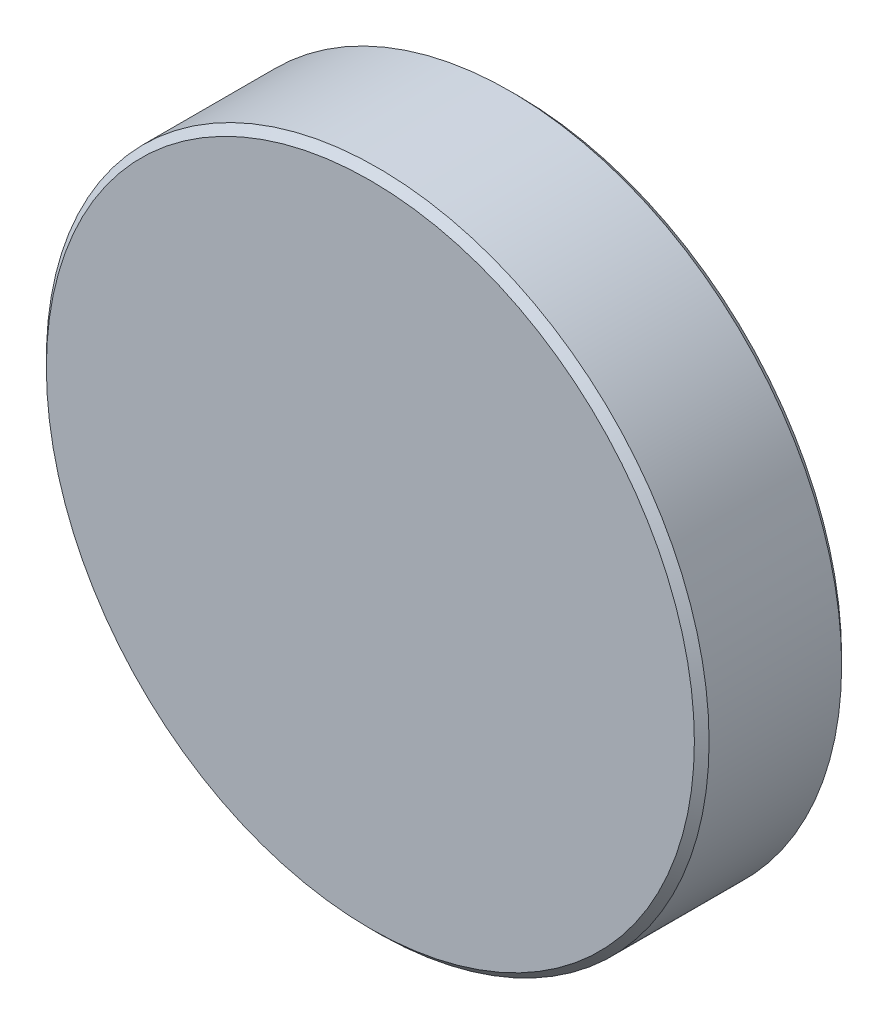
ISO-10303-21;
HEADER;
FILE_DESCRIPTION(('STEP AP214'),'2;1');
FILE_NAME('part.step','',(''),(''),'','','');
FILE_SCHEMA(('AUTOMOTIVE_DESIGN { 1 0 10303 214 1 1 1 1 }'));
ENDSEC;
DATA;
#1=APPLICATION_CONTEXT('core data for automotive mechanical design processes');
#2=APPLICATION_PROTOCOL_DEFINITION('international standard','automotive_design',2000,#1);
#3=PRODUCT_CONTEXT('',#1,'mechanical');
#4=PRODUCT('Part','Part','',(#3));
#5=PRODUCT_RELATED_PRODUCT_CATEGORY('part','',(#4));
#6=PRODUCT_DEFINITION_FORMATION('','',#4);
#7=PRODUCT_DEFINITION_CONTEXT('part definition',#1,'design');
#8=PRODUCT_DEFINITION('design','',#6,#7);
#9=PRODUCT_DEFINITION_SHAPE('','',#8);
#10=(LENGTH_UNIT() NAMED_UNIT(*) SI_UNIT(.MILLI.,.METRE.));
#11=(NAMED_UNIT(*) PLANE_ANGLE_UNIT() SI_UNIT($,.RADIAN.));
#12=(NAMED_UNIT(*) SI_UNIT($,.STERADIAN.) SOLID_ANGLE_UNIT());
#13=UNCERTAINTY_MEASURE_WITH_UNIT(LENGTH_MEASURE(1.E-05),#10,'distance_accuracy_value','');
#14=(GEOMETRIC_REPRESENTATION_CONTEXT(3) GLOBAL_UNCERTAINTY_ASSIGNED_CONTEXT((#13)) GLOBAL_UNIT_ASSIGNED_CONTEXT((#10,
#11,#12)) REPRESENTATION_CONTEXT('',''));
#15=CARTESIAN_POINT('',(0.,0.,0.));
#16=DIRECTION('',(0.,0.,1.));
#17=DIRECTION('',(1.,0.,0.));
#18=AXIS2_PLACEMENT_3D('',#15,#16,#17);
#19=CARTESIAN_POINT('',(0.,0.,2.));
#20=DIRECTION('',(0.,0.,-1.));
#21=DIRECTION('',(-1.,0.,0.));
#22=AXIS2_PLACEMENT_3D('',#19,#20,#21);
#23=CYLINDRICAL_SURFACE('',#22,4.5);
#24=CARTESIAN_POINT('',(0.,0.,0.0999999999999994));
#25=DIRECTION('',(0.,0.,1.));
#26=DIRECTION('',(1.,0.,0.));
#27=AXIS2_PLACEMENT_3D('',#24,#25,#26);
#28=CIRCLE('',#27,4.5);
#29=CARTESIAN_POINT('',(4.5,0.,0.0999999999999994));
#30=VERTEX_POINT('',#29);
#31=EDGE_CURVE('E45',#30,#30,#28,.T.);
#32=ORIENTED_EDGE('',*,*,#31,.T.);
#33=EDGE_LOOP('',(#32));
#34=FACE_BOUND('',#33,.T.);
#35=CARTESIAN_POINT('',(0.,0.,1.9));
#36=DIRECTION('',(0.,0.,1.));
#37=DIRECTION('',(1.,0.,0.));
#38=AXIS2_PLACEMENT_3D('',#35,#36,#37);
#39=CIRCLE('',#38,4.5);
#40=CARTESIAN_POINT('',(4.5,0.,1.9));
#41=VERTEX_POINT('',#40);
#42=EDGE_CURVE('E49',#41,#41,#39,.F.);
#43=ORIENTED_EDGE('',*,*,#42,.T.);
#44=EDGE_LOOP('',(#43));
#45=FACE_BOUND('',#44,.T.);
#46=ADVANCED_FACE('F34',(#34,#45),#23,.T.);
#47=CARTESIAN_POINT('',(0.,0.,2.));
#48=DIRECTION('',(0.,0.,1.));
#49=DIRECTION('',(1.,0.,0.));
#50=AXIS2_PLACEMENT_3D('',#47,#48,#49);
#51=PLANE('',#50);
#52=CARTESIAN_POINT('',(0.,0.,2.));
#53=DIRECTION('',(0.,0.,1.));
#54=DIRECTION('',(1.,0.,0.));
#55=AXIS2_PLACEMENT_3D('',#52,#53,#54);
#56=CIRCLE('',#55,4.4);
#57=CARTESIAN_POINT('',(4.4,0.,2.));
#58=VERTEX_POINT('',#57);
#59=EDGE_CURVE('E10',#58,#58,#56,.T.);
#60=ORIENTED_EDGE('',*,*,#59,.T.);
#61=EDGE_LOOP('',(#60));
#62=FACE_BOUND('',#61,.T.);
#63=ADVANCED_FACE('F65',(#62),#51,.T.);
#64=CARTESIAN_POINT('',(0.,0.,0.));
#65=DIRECTION('',(0.,0.,1.));
#66=DIRECTION('',(1.,0.,0.));
#67=AXIS2_PLACEMENT_3D('',#64,#65,#66);
#68=PLANE('',#67);
#69=CARTESIAN_POINT('',(0.,0.,0.));
#70=DIRECTION('',(0.,0.,1.));
#71=DIRECTION('',(1.,0.,0.));
#72=AXIS2_PLACEMENT_3D('',#69,#70,#71);
#73=CIRCLE('',#72,4.4);
#74=CARTESIAN_POINT('',(4.4,0.,0.));
#75=VERTEX_POINT('',#74);
#76=EDGE_CURVE('E41',#75,#75,#73,.F.);
#77=ORIENTED_EDGE('',*,*,#76,.T.);
#78=EDGE_LOOP('',(#77));
#79=FACE_BOUND('',#78,.T.);
#80=ADVANCED_FACE('F62',(#79),#68,.F.);
#81=CARTESIAN_POINT('',(0.,0.,0.0999999999999994));
#82=DIRECTION('',(0.,0.,1.));
#83=DIRECTION('',(1.,0.,0.));
#84=AXIS2_PLACEMENT_3D('',#81,#82,#83);
#85=CONICAL_SURFACE('',#84,4.5,0.785398163397453);
#86=ORIENTED_EDGE('',*,*,#76,.F.);
#87=EDGE_LOOP('',(#86));
#88=FACE_BOUND('',#87,.T.);
#89=ORIENTED_EDGE('',*,*,#31,.F.);
#90=EDGE_LOOP('',(#89));
#91=FACE_BOUND('',#90,.T.);
#92=ADVANCED_FACE('F58',(#88,#91),#85,.T.);
#93=CARTESIAN_POINT('',(0.,0.,2.));
#94=DIRECTION('',(0.,0.,-1.));
#95=DIRECTION('',(-1.,0.,0.));
#96=AXIS2_PLACEMENT_3D('',#93,#94,#95);
#97=CONICAL_SURFACE('',#96,4.4,0.785398163397457);
#98=ORIENTED_EDGE('',*,*,#42,.F.);
#99=EDGE_LOOP('',(#98));
#100=FACE_BOUND('',#99,.T.);
#101=ORIENTED_EDGE('',*,*,#59,.F.);
#102=EDGE_LOOP('',(#101));
#103=FACE_BOUND('',#102,.T.);
#104=ADVANCED_FACE('F36',(#100,#103),#97,.T.);
#105=CLOSED_SHELL('',(#46,#63,#80,#92,#104));
#106=MANIFOLD_SOLID_BREP('B2',#105);
#107=ADVANCED_BREP_SHAPE_REPRESENTATION('',(#18,#106),#14);
#108=SHAPE_DEFINITION_REPRESENTATION(#9,#107);
ENDSEC;
END-ISO-10303-21;
